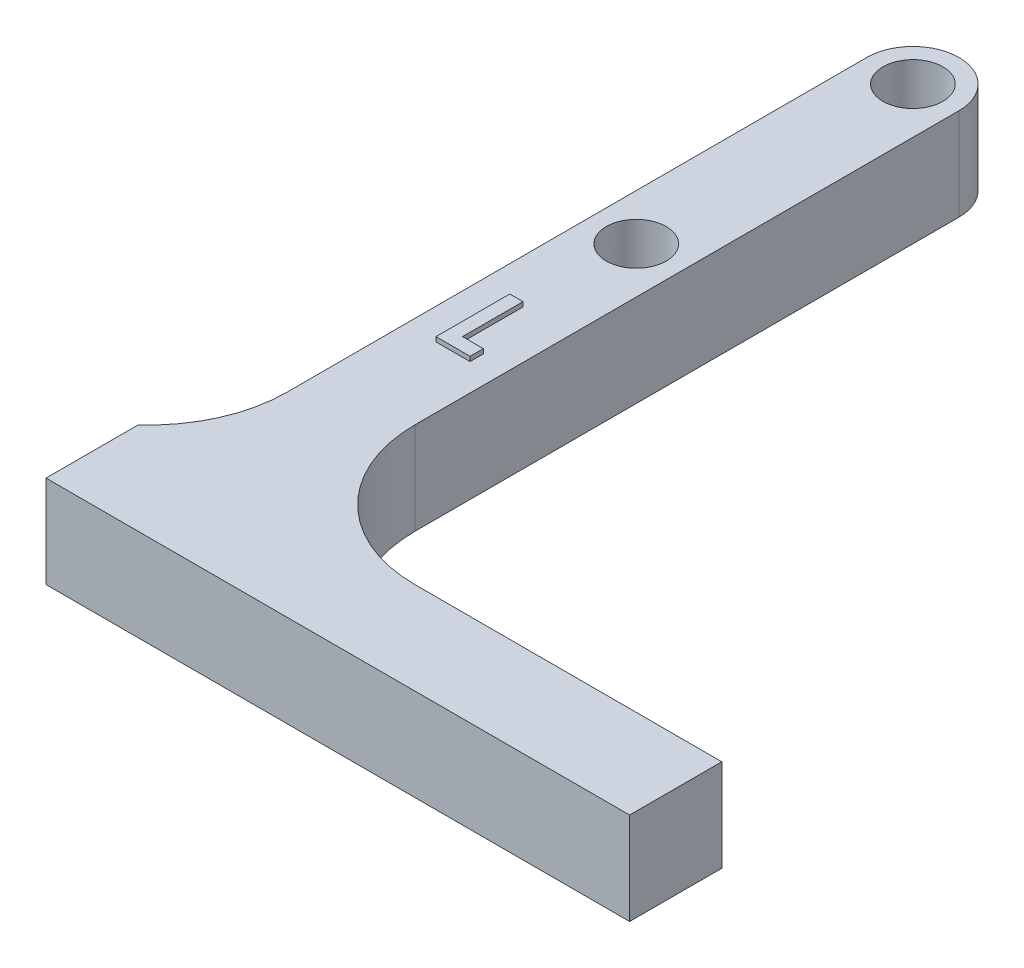
ISO-10303-21;
HEADER;
FILE_DESCRIPTION(('STEP AP214'),'2;1');
FILE_NAME('part.step','',(''),(''),'','','');
FILE_SCHEMA(('AUTOMOTIVE_DESIGN { 1 0 10303 214 1 1 1 1 }'));
ENDSEC;
DATA;
#1=APPLICATION_CONTEXT('core data for automotive mechanical design processes');
#2=APPLICATION_PROTOCOL_DEFINITION('international standard','automotive_design',2000,#1);
#3=PRODUCT_CONTEXT('',#1,'mechanical');
#4=PRODUCT('Part','Part','',(#3));
#5=PRODUCT_RELATED_PRODUCT_CATEGORY('part','',(#4));
#6=PRODUCT_DEFINITION_FORMATION('','',#4);
#7=PRODUCT_DEFINITION_CONTEXT('part definition',#1,'design');
#8=PRODUCT_DEFINITION('design','',#6,#7);
#9=PRODUCT_DEFINITION_SHAPE('','',#8);
#10=(LENGTH_UNIT() NAMED_UNIT(*) SI_UNIT(.MILLI.,.METRE.));
#11=(NAMED_UNIT(*) PLANE_ANGLE_UNIT() SI_UNIT($,.RADIAN.));
#12=(NAMED_UNIT(*) SI_UNIT($,.STERADIAN.) SOLID_ANGLE_UNIT());
#13=UNCERTAINTY_MEASURE_WITH_UNIT(LENGTH_MEASURE(1.E-05),#10,'distance_accuracy_value','');
#14=(GEOMETRIC_REPRESENTATION_CONTEXT(3) GLOBAL_UNCERTAINTY_ASSIGNED_CONTEXT((#13)) GLOBAL_UNIT_ASSIGNED_CONTEXT((#10,
#11,#12)) REPRESENTATION_CONTEXT('',''));
#15=CARTESIAN_POINT('',(0.,0.,0.));
#16=DIRECTION('',(0.,0.,1.));
#17=DIRECTION('',(1.,0.,0.));
#18=AXIS2_PLACEMENT_3D('',#15,#16,#17);
#19=CARTESIAN_POINT('',(10.,10.,0.));
#20=DIRECTION('',(0.,0.,-1.));
#21=DIRECTION('',(-1.,0.,0.));
#22=AXIS2_PLACEMENT_3D('',#19,#20,#21);
#23=PLANE('',#22);
#24=DIRECTION('',(1.,0.,0.));
#25=VECTOR('',#24,1.);
#26=CARTESIAN_POINT('',(10.,0.,0.));
#27=LINE('',#26,#25);
#28=CARTESIAN_POINT('',(-5.,0.,0.));
#29=VERTEX_POINT('',#28);
#30=CARTESIAN_POINT('',(58.28,0.,0.));
#31=VERTEX_POINT('',#30);
#32=EDGE_CURVE('E235',#29,#31,#27,.T.);
#33=ORIENTED_EDGE('',*,*,#32,.T.);
#34=DIRECTION('',(0.,-1.,0.));
#35=VECTOR('',#34,1.);
#36=CARTESIAN_POINT('',(58.28,10.,0.));
#37=LINE('',#36,#35);
#38=CARTESIAN_POINT('',(58.28,10.,0.));
#39=VERTEX_POINT('',#38);
#40=EDGE_CURVE('E303',#39,#31,#37,.T.);
#41=ORIENTED_EDGE('',*,*,#40,.F.);
#42=DIRECTION('',(1.,0.,0.));
#43=VECTOR('',#42,1.);
#44=CARTESIAN_POINT('',(0.,10.,0.));
#45=LINE('',#44,#43);
#46=CARTESIAN_POINT('',(-5.,10.,0.));
#47=VERTEX_POINT('',#46);
#48=EDGE_CURVE('E239',#47,#39,#45,.T.);
#49=ORIENTED_EDGE('',*,*,#48,.F.);
#50=DIRECTION('',(0.,-1.,0.));
#51=VECTOR('',#50,1.);
#52=CARTESIAN_POINT('',(-5.,10.,0.));
#53=LINE('',#52,#51);
#54=EDGE_CURVE('E262',#47,#29,#53,.T.);
#55=ORIENTED_EDGE('',*,*,#54,.T.);
#56=EDGE_LOOP('',(#33,#41,#49,#55));
#57=FACE_BOUND('',#56,.T.);
#58=ADVANCED_FACE('F40',(#57),#23,.F.);
#59=CARTESIAN_POINT('',(58.28,10.,0.));
#60=DIRECTION('',(-1.,0.,0.));
#61=DIRECTION('',(0.,0.,1.));
#62=AXIS2_PLACEMENT_3D('',#59,#60,#61);
#63=PLANE('',#62);
#64=DIRECTION('',(0.,0.,-1.));
#65=VECTOR('',#64,1.);
#66=CARTESIAN_POINT('',(58.28,0.,0.));
#67=LINE('',#66,#65);
#68=CARTESIAN_POINT('',(58.28,0.,-10.));
#69=VERTEX_POINT('',#68);
#70=EDGE_CURVE('E265',#31,#69,#67,.T.);
#71=ORIENTED_EDGE('',*,*,#70,.T.);
#72=DIRECTION('',(0.,-1.,0.));
#73=VECTOR('',#72,1.);
#74=CARTESIAN_POINT('',(58.28,10.,-10.));
#75=LINE('',#74,#73);
#76=CARTESIAN_POINT('',(58.28,10.,-10.));
#77=VERTEX_POINT('',#76);
#78=EDGE_CURVE('E299',#77,#69,#75,.T.);
#79=ORIENTED_EDGE('',*,*,#78,.F.);
#80=DIRECTION('',(0.,0.,-1.));
#81=VECTOR('',#80,1.);
#82=CARTESIAN_POINT('',(58.28,10.,0.));
#83=LINE('',#82,#81);
#84=EDGE_CURVE('E242',#39,#77,#83,.T.);
#85=ORIENTED_EDGE('',*,*,#84,.F.);
#86=ORIENTED_EDGE('',*,*,#40,.T.);
#87=EDGE_LOOP('',(#71,#79,#85,#86));
#88=FACE_BOUND('',#87,.T.);
#89=ADVANCED_FACE('F365',(#88),#63,.F.);
#90=CARTESIAN_POINT('',(10.,10.,-10.));
#91=DIRECTION('',(0.,0.,1.));
#92=DIRECTION('',(1.,0.,0.));
#93=AXIS2_PLACEMENT_3D('',#90,#91,#92);
#94=PLANE('',#93);
#95=DIRECTION('',(-1.,0.,0.));
#96=VECTOR('',#95,1.);
#97=CARTESIAN_POINT('',(10.,0.,-10.));
#98=LINE('',#97,#96);
#99=CARTESIAN_POINT('',(25.,0.,-10.));
#100=VERTEX_POINT('',#99);
#101=EDGE_CURVE('E268',#69,#100,#98,.T.);
#102=ORIENTED_EDGE('',*,*,#101,.T.);
#103=DIRECTION('',(0.,-1.,0.));
#104=VECTOR('',#103,1.);
#105=CARTESIAN_POINT('',(25.,10.,-10.));
#106=LINE('',#105,#104);
#107=CARTESIAN_POINT('',(25.,10.,-10.));
#108=VERTEX_POINT('',#107);
#109=EDGE_CURVE('E56',#100,#108,#106,.F.);
#110=ORIENTED_EDGE('',*,*,#109,.T.);
#111=DIRECTION('',(-1.,0.,0.));
#112=VECTOR('',#111,1.);
#113=CARTESIAN_POINT('',(10.,10.,-10.));
#114=LINE('',#113,#112);
#115=EDGE_CURVE('E246',#77,#108,#114,.T.);
#116=ORIENTED_EDGE('',*,*,#115,.F.);
#117=ORIENTED_EDGE('',*,*,#78,.T.);
#118=EDGE_LOOP('',(#102,#110,#116,#117));
#119=FACE_BOUND('',#118,.T.);
#120=ADVANCED_FACE('F362',(#119),#94,.F.);
#121=CARTESIAN_POINT('',(10.,10.,-10.));
#122=DIRECTION('',(-1.,0.,0.));
#123=DIRECTION('',(0.,0.,1.));
#124=AXIS2_PLACEMENT_3D('',#121,#122,#123);
#125=PLANE('',#124);
#126=DIRECTION('',(0.,0.,-1.));
#127=VECTOR('',#126,1.);
#128=CARTESIAN_POINT('',(10.,10.,-10.));
#129=LINE('',#128,#127);
#130=CARTESIAN_POINT('',(10.,10.,-25.));
#131=VERTEX_POINT('',#130);
#132=CARTESIAN_POINT('',(10.,10.,-84.));
#133=VERTEX_POINT('',#132);
#134=EDGE_CURVE('E249',#131,#133,#129,.T.);
#135=ORIENTED_EDGE('',*,*,#134,.F.);
#136=DIRECTION('',(0.,-1.,0.));
#137=VECTOR('',#136,1.);
#138=CARTESIAN_POINT('',(10.,0.,-25.));
#139=LINE('',#138,#137);
#140=CARTESIAN_POINT('',(10.,0.,-25.));
#141=VERTEX_POINT('',#140);
#142=EDGE_CURVE('E318',#131,#141,#139,.T.);
#143=ORIENTED_EDGE('',*,*,#142,.T.);
#144=DIRECTION('',(0.,0.,-1.));
#145=VECTOR('',#144,1.);
#146=CARTESIAN_POINT('',(10.,0.,-10.));
#147=LINE('',#146,#145);
#148=CARTESIAN_POINT('',(10.,0.,-84.));
#149=VERTEX_POINT('',#148);
#150=EDGE_CURVE('E271',#141,#149,#147,.T.);
#151=ORIENTED_EDGE('',*,*,#150,.T.);
#152=DIRECTION('',(0.,-1.,0.));
#153=VECTOR('',#152,1.);
#154=CARTESIAN_POINT('',(10.,10.,-84.));
#155=LINE('',#154,#153);
#156=EDGE_CURVE('E295',#133,#149,#155,.T.);
#157=ORIENTED_EDGE('',*,*,#156,.F.);
#158=EDGE_LOOP('',(#135,#143,#151,#157));
#159=FACE_BOUND('',#158,.T.);
#160=ADVANCED_FACE('F356',(#159),#125,.F.);
#161=CARTESIAN_POINT('',(5.,10.,-84.));
#162=DIRECTION('',(0.,-1.,0.));
#163=DIRECTION('',(0.,0.,-1.));
#164=AXIS2_PLACEMENT_3D('',#161,#162,#163);
#165=CYLINDRICAL_SURFACE('',#164,5.);
#166=CARTESIAN_POINT('',(5.,0.,-84.));
#167=DIRECTION('',(0.,1.,0.));
#168=DIRECTION('',(0.,0.,-1.));
#169=AXIS2_PLACEMENT_3D('',#166,#167,#168);
#170=CIRCLE('',#169,5.);
#171=CARTESIAN_POINT('',(0.,0.,-84.));
#172=VERTEX_POINT('',#171);
#173=EDGE_CURVE('E274',#149,#172,#170,.T.);
#174=ORIENTED_EDGE('',*,*,#173,.T.);
#175=DIRECTION('',(0.,-1.,0.));
#176=VECTOR('',#175,1.);
#177=CARTESIAN_POINT('',(0.,10.,-84.));
#178=LINE('',#177,#176);
#179=CARTESIAN_POINT('',(0.,10.,-84.));
#180=VERTEX_POINT('',#179);
#181=EDGE_CURVE('E291',#180,#172,#178,.T.);
#182=ORIENTED_EDGE('',*,*,#181,.F.);
#183=CARTESIAN_POINT('',(5.,10.,-84.));
#184=DIRECTION('',(0.,1.,0.));
#185=DIRECTION('',(0.,0.,-1.));
#186=AXIS2_PLACEMENT_3D('',#183,#184,#185);
#187=CIRCLE('',#186,5.);
#188=EDGE_CURVE('E252',#133,#180,#187,.T.);
#189=ORIENTED_EDGE('',*,*,#188,.F.);
#190=ORIENTED_EDGE('',*,*,#156,.T.);
#191=EDGE_LOOP('',(#174,#182,#189,#190));
#192=FACE_BOUND('',#191,.T.);
#193=ADVANCED_FACE('F352',(#192),#165,.T.);
#194=CARTESIAN_POINT('',(0.,10.,-10.));
#195=DIRECTION('',(1.,0.,0.));
#196=DIRECTION('',(0.,0.,-1.));
#197=AXIS2_PLACEMENT_3D('',#194,#195,#196);
#198=PLANE('',#197);
#199=DIRECTION('',(0.,0.,1.));
#200=VECTOR('',#199,1.);
#201=CARTESIAN_POINT('',(0.,0.,-10.));
#202=LINE('',#201,#200);
#203=CARTESIAN_POINT('',(0.,0.,-21.1803398874989));
#204=VERTEX_POINT('',#203);
#205=EDGE_CURVE('E277',#172,#204,#202,.T.);
#206=ORIENTED_EDGE('',*,*,#205,.T.);
#207=DIRECTION('',(0.,1.,0.));
#208=VECTOR('',#207,1.);
#209=CARTESIAN_POINT('',(0.,10.,-21.1803398874989));
#210=LINE('',#209,#208);
#211=CARTESIAN_POINT('',(0.,10.,-21.1803398874989));
#212=VERTEX_POINT('',#211);
#213=EDGE_CURVE('E307',#204,#212,#210,.T.);
#214=ORIENTED_EDGE('',*,*,#213,.T.);
#215=DIRECTION('',(0.,0.,1.));
#216=VECTOR('',#215,1.);
#217=CARTESIAN_POINT('',(0.,10.,-10.));
#218=LINE('',#217,#216);
#219=EDGE_CURVE('E255',#180,#212,#218,.T.);
#220=ORIENTED_EDGE('',*,*,#219,.F.);
#221=ORIENTED_EDGE('',*,*,#181,.T.);
#222=EDGE_LOOP('',(#206,#214,#220,#221));
#223=FACE_BOUND('',#222,.T.);
#224=ADVANCED_FACE('F348',(#223),#198,.F.);
#225=CARTESIAN_POINT('',(-5.,10.,-10.));
#226=DIRECTION('',(1.,0.,0.));
#227=DIRECTION('',(0.,0.,-1.));
#228=AXIS2_PLACEMENT_3D('',#225,#226,#227);
#229=PLANE('',#228);
#230=DIRECTION('',(0.,0.,1.));
#231=VECTOR('',#230,1.);
#232=CARTESIAN_POINT('',(-5.,0.,-10.));
#233=LINE('',#232,#231);
#234=CARTESIAN_POINT('',(-5.,0.,-10.));
#235=VERTEX_POINT('',#234);
#236=EDGE_CURVE('E243',#235,#29,#233,.T.);
#237=ORIENTED_EDGE('',*,*,#236,.T.);
#238=ORIENTED_EDGE('',*,*,#54,.F.);
#239=DIRECTION('',(0.,0.,1.));
#240=VECTOR('',#239,1.);
#241=CARTESIAN_POINT('',(-5.,10.,-10.));
#242=LINE('',#241,#240);
#243=CARTESIAN_POINT('',(-5.,10.,-10.));
#244=VERTEX_POINT('',#243);
#245=EDGE_CURVE('E259',#244,#47,#242,.T.);
#246=ORIENTED_EDGE('',*,*,#245,.F.);
#247=DIRECTION('',(0.,-1.,0.));
#248=VECTOR('',#247,1.);
#249=CARTESIAN_POINT('',(-5.,10.,-10.));
#250=LINE('',#249,#248);
#251=EDGE_CURVE('E287',#244,#235,#250,.T.);
#252=ORIENTED_EDGE('',*,*,#251,.T.);
#253=EDGE_LOOP('',(#237,#238,#246,#252));
#254=FACE_BOUND('',#253,.T.);
#255=ADVANCED_FACE('F340',(#254),#229,.F.);
#256=CARTESIAN_POINT('',(5.,10.,-84.));
#257=DIRECTION('',(0.,-1.,0.));
#258=DIRECTION('',(0.,0.,-1.));
#259=AXIS2_PLACEMENT_3D('',#256,#257,#258);
#260=PLANE('',#259);
#261=CARTESIAN_POINT('',(5.,10.,-84.));
#262=DIRECTION('',(0.,1.,0.));
#263=DIRECTION('',(0.,0.,1.));
#264=AXIS2_PLACEMENT_3D('',#261,#262,#263);
#265=CIRCLE('',#264,3.25);
#266=CARTESIAN_POINT('',(5.,10.,-80.75));
#267=VERTEX_POINT('',#266);
#268=EDGE_CURVE('E599',#267,#267,#265,.T.);
#269=ORIENTED_EDGE('',*,*,#268,.F.);
#270=EDGE_LOOP('',(#269));
#271=FACE_BOUND('',#270,.T.);
#272=CARTESIAN_POINT('',(5.,10.,-54.));
#273=DIRECTION('',(0.,1.,0.));
#274=DIRECTION('',(0.,0.,1.));
#275=AXIS2_PLACEMENT_3D('',#272,#273,#274);
#276=CIRCLE('',#275,3.25);
#277=CARTESIAN_POINT('',(5.,10.,-50.75));
#278=VERTEX_POINT('',#277);
#279=EDGE_CURVE('E604',#278,#278,#276,.T.);
#280=ORIENTED_EDGE('',*,*,#279,.F.);
#281=EDGE_LOOP('',(#280));
#282=FACE_BOUND('',#281,.T.);
#283=DIRECTION('',(-1.,0.,0.));
#284=VECTOR('',#283,1.);
#285=CARTESIAN_POINT('',(7.05128205128205,10.,-33.9300041510496));
#286=LINE('',#285,#284);
#287=CARTESIAN_POINT('',(7.05128205128205,10.,-33.9300041510496));
#288=VERTEX_POINT('',#287);
#289=CARTESIAN_POINT('',(3.35897435897436,10.,-33.9300041510496));
#290=VERTEX_POINT('',#289);
#291=EDGE_CURVE('E178',#288,#290,#286,.T.);
#292=ORIENTED_EDGE('',*,*,#291,.T.);
#293=DIRECTION('',(0.,0.,-1.));
#294=VECTOR('',#293,1.);
#295=CARTESIAN_POINT('',(3.35897435897436,10.,-33.9300041510496));
#296=LINE('',#295,#294);
#297=CARTESIAN_POINT('',(3.35897435897436,10.,-41.9300041510496));
#298=VERTEX_POINT('',#297);
#299=EDGE_CURVE('E200',#290,#298,#296,.T.);
#300=ORIENTED_EDGE('',*,*,#299,.T.);
#301=DIRECTION('',(1.,0.,0.));
#302=VECTOR('',#301,1.);
#303=CARTESIAN_POINT('',(3.35897435897436,10.,-41.9300041510496));
#304=LINE('',#303,#302);
#305=CARTESIAN_POINT('',(4.79487179487179,10.,-41.9300041510496));
#306=VERTEX_POINT('',#305);
#307=EDGE_CURVE('E154',#298,#306,#304,.T.);
#308=ORIENTED_EDGE('',*,*,#307,.T.);
#309=DIRECTION('',(0.,0.,1.));
#310=VECTOR('',#309,1.);
#311=CARTESIAN_POINT('',(4.79487179487179,10.,-41.9300041510496));
#312=LINE('',#311,#310);
#313=CARTESIAN_POINT('',(4.79487179487179,10.,-35.3659015869471));
#314=VERTEX_POINT('',#313);
#315=EDGE_CURVE('E206',#306,#314,#312,.T.);
#316=ORIENTED_EDGE('',*,*,#315,.T.);
#317=DIRECTION('',(1.,0.,0.));
#318=VECTOR('',#317,1.);
#319=CARTESIAN_POINT('',(4.79487179487179,10.,-35.3659015869471));
#320=LINE('',#319,#318);
#321=CARTESIAN_POINT('',(7.05128205128205,10.,-35.3659015869471));
#322=VERTEX_POINT('',#321);
#323=EDGE_CURVE('E210',#314,#322,#320,.T.);
#324=ORIENTED_EDGE('',*,*,#323,.T.);
#325=DIRECTION('',(0.,0.,1.));
#326=VECTOR('',#325,1.);
#327=CARTESIAN_POINT('',(7.05128205128205,10.,-35.3659015869471));
#328=LINE('',#327,#326);
#329=EDGE_CURVE('E182',#322,#288,#328,.T.);
#330=ORIENTED_EDGE('',*,*,#329,.T.);
#331=EDGE_LOOP('',(#292,#300,#308,#316,#324,#330));
#332=FACE_BOUND('',#331,.T.);
#333=ORIENTED_EDGE('',*,*,#48,.T.);
#334=ORIENTED_EDGE('',*,*,#84,.T.);
#335=ORIENTED_EDGE('',*,*,#115,.T.);
#336=CARTESIAN_POINT('',(25.,10.,-25.));
#337=DIRECTION('',(0.,-1.,0.));
#338=DIRECTION('',(0.,0.,-1.));
#339=AXIS2_PLACEMENT_3D('',#336,#337,#338);
#340=CIRCLE('',#339,15.);
#341=EDGE_CURVE('E12',#108,#131,#340,.T.);
#342=ORIENTED_EDGE('',*,*,#341,.T.);
#343=ORIENTED_EDGE('',*,*,#134,.T.);
#344=ORIENTED_EDGE('',*,*,#188,.T.);
#345=ORIENTED_EDGE('',*,*,#219,.T.);
#346=CARTESIAN_POINT('',(-15.,10.,-21.1803398874989));
#347=DIRECTION('',(0.,-1.,0.));
#348=DIRECTION('',(0.,0.,-1.));
#349=AXIS2_PLACEMENT_3D('',#346,#347,#348);
#350=CIRCLE('',#349,15.);
#351=EDGE_CURVE('E327',#212,#244,#350,.T.);
#352=ORIENTED_EDGE('',*,*,#351,.T.);
#353=ORIENTED_EDGE('',*,*,#245,.T.);
#354=EDGE_LOOP('',(#333,#334,#335,#342,#343,#344,#345,#352,#353));
#355=FACE_BOUND('',#354,.T.);
#356=ADVANCED_FACE('F333',(#271,#282,#332,#355),#260,.F.);
#357=CARTESIAN_POINT('',(5.,0.,-84.));
#358=DIRECTION('',(0.,-1.,0.));
#359=DIRECTION('',(0.,0.,-1.));
#360=AXIS2_PLACEMENT_3D('',#357,#358,#359);
#361=PLANE('',#360);
#362=CARTESIAN_POINT('',(5.,0.,-84.));
#363=DIRECTION('',(0.,1.,0.));
#364=DIRECTION('',(0.,0.,1.));
#365=AXIS2_PLACEMENT_3D('',#362,#363,#364);
#366=CIRCLE('',#365,1.5);
#367=CARTESIAN_POINT('',(5.,0.,-82.5));
#368=VERTEX_POINT('',#367);
#369=EDGE_CURVE('E231',#368,#368,#366,.T.);
#370=ORIENTED_EDGE('',*,*,#369,.T.);
#371=EDGE_LOOP('',(#370));
#372=FACE_BOUND('',#371,.T.);
#373=CARTESIAN_POINT('',(5.,0.,-54.));
#374=DIRECTION('',(0.,1.,0.));
#375=DIRECTION('',(0.,0.,1.));
#376=AXIS2_PLACEMENT_3D('',#373,#374,#375);
#377=CIRCLE('',#376,1.5);
#378=CARTESIAN_POINT('',(5.,0.,-52.5));
#379=VERTEX_POINT('',#378);
#380=EDGE_CURVE('E219',#379,#379,#377,.T.);
#381=ORIENTED_EDGE('',*,*,#380,.T.);
#382=EDGE_LOOP('',(#381));
#383=FACE_BOUND('',#382,.T.);
#384=ORIENTED_EDGE('',*,*,#32,.F.);
#385=ORIENTED_EDGE('',*,*,#236,.F.);
#386=CARTESIAN_POINT('',(-15.,0.,-21.1803398874989));
#387=DIRECTION('',(0.,-1.,0.));
#388=DIRECTION('',(0.,0.,-1.));
#389=AXIS2_PLACEMENT_3D('',#386,#387,#388);
#390=CIRCLE('',#389,15.);
#391=EDGE_CURVE('E324',#235,#204,#390,.F.);
#392=ORIENTED_EDGE('',*,*,#391,.T.);
#393=ORIENTED_EDGE('',*,*,#205,.F.);
#394=ORIENTED_EDGE('',*,*,#173,.F.);
#395=ORIENTED_EDGE('',*,*,#150,.F.);
#396=CARTESIAN_POINT('',(25.,0.,-25.));
#397=DIRECTION('',(0.,-1.,0.));
#398=DIRECTION('',(0.,0.,-1.));
#399=AXIS2_PLACEMENT_3D('',#396,#397,#398);
#400=CIRCLE('',#399,15.);
#401=EDGE_CURVE('E49',#141,#100,#400,.F.);
#402=ORIENTED_EDGE('',*,*,#401,.T.);
#403=ORIENTED_EDGE('',*,*,#101,.F.);
#404=ORIENTED_EDGE('',*,*,#70,.F.);
#405=EDGE_LOOP('',(#384,#385,#392,#393,#394,#395,#402,#403,#404));
#406=FACE_BOUND('',#405,.T.);
#407=ADVANCED_FACE('F345',(#372,#383,#406),#361,.T.);
#408=CARTESIAN_POINT('',(5.,0.,-54.));
#409=DIRECTION('',(0.,1.,0.));
#410=DIRECTION('',(0.,0.,1.));
#411=AXIS2_PLACEMENT_3D('',#408,#409,#410);
#412=CYLINDRICAL_SURFACE('',#411,1.5);
#413=CARTESIAN_POINT('',(5.,5.,-54.));
#414=DIRECTION('',(0.,-1.,0.));
#415=DIRECTION('',(0.,0.,-1.));
#416=AXIS2_PLACEMENT_3D('',#413,#414,#415);
#417=CIRCLE('',#416,1.5);
#418=CARTESIAN_POINT('',(5.,5.,-55.5));
#419=VERTEX_POINT('',#418);
#420=EDGE_CURVE('E203',#419,#419,#417,.F.);
#421=ORIENTED_EDGE('',*,*,#420,.T.);
#422=EDGE_LOOP('',(#421));
#423=FACE_BOUND('',#422,.T.);
#424=ORIENTED_EDGE('',*,*,#380,.F.);
#425=EDGE_LOOP('',(#424));
#426=FACE_BOUND('',#425,.T.);
#427=ADVANCED_FACE('F421',(#423,#426),#412,.F.);
#428=CARTESIAN_POINT('',(5.,0.,-84.));
#429=DIRECTION('',(0.,1.,0.));
#430=DIRECTION('',(0.,0.,1.));
#431=AXIS2_PLACEMENT_3D('',#428,#429,#430);
#432=CYLINDRICAL_SURFACE('',#431,1.5);
#433=CARTESIAN_POINT('',(5.,5.,-84.));
#434=DIRECTION('',(0.,-1.,0.));
#435=DIRECTION('',(0.,0.,-1.));
#436=AXIS2_PLACEMENT_3D('',#433,#434,#435);
#437=CIRCLE('',#436,1.5);
#438=CARTESIAN_POINT('',(5.,5.,-85.5));
#439=VERTEX_POINT('',#438);
#440=EDGE_CURVE('E308',#439,#439,#437,.F.);
#441=ORIENTED_EDGE('',*,*,#440,.T.);
#442=EDGE_LOOP('',(#441));
#443=FACE_BOUND('',#442,.T.);
#444=ORIENTED_EDGE('',*,*,#369,.F.);
#445=EDGE_LOOP('',(#444));
#446=FACE_BOUND('',#445,.T.);
#447=ADVANCED_FACE('F418',(#443,#446),#432,.F.);
#448=CARTESIAN_POINT('',(3.35897435897436,10.5,-33.9300041510496));
#449=DIRECTION('',(-1.,0.,0.));
#450=DIRECTION('',(0.,0.,1.));
#451=AXIS2_PLACEMENT_3D('',#448,#449,#450);
#452=PLANE('',#451);
#453=ORIENTED_EDGE('',*,*,#299,.F.);
#454=DIRECTION('',(0.,-1.,0.));
#455=VECTOR('',#454,1.);
#456=CARTESIAN_POINT('',(3.35897435897436,10.5,-33.9300041510496));
#457=LINE('',#456,#455);
#458=CARTESIAN_POINT('',(3.35897435897436,10.5,-33.9300041510496));
#459=VERTEX_POINT('',#458);
#460=EDGE_CURVE('E176',#459,#290,#457,.T.);
#461=ORIENTED_EDGE('',*,*,#460,.F.);
#462=DIRECTION('',(0.,0.,-1.));
#463=VECTOR('',#462,1.);
#464=CARTESIAN_POINT('',(3.35897435897436,10.5,-33.9300041510496));
#465=LINE('',#464,#463);
#466=CARTESIAN_POINT('',(3.35897435897436,10.5,-41.9300041510496));
#467=VERTEX_POINT('',#466);
#468=EDGE_CURVE('E168',#459,#467,#465,.T.);
#469=ORIENTED_EDGE('',*,*,#468,.T.);
#470=DIRECTION('',(0.,-1.,0.));
#471=VECTOR('',#470,1.);
#472=CARTESIAN_POINT('',(3.35897435897436,10.5,-41.9300041510496));
#473=LINE('',#472,#471);
#474=EDGE_CURVE('E148',#467,#298,#473,.T.);
#475=ORIENTED_EDGE('',*,*,#474,.T.);
#476=EDGE_LOOP('',(#453,#461,#469,#475));
#477=FACE_BOUND('',#476,.T.);
#478=ADVANCED_FACE('F175',(#477),#452,.T.);
#479=CARTESIAN_POINT('',(7.05128205128205,10.5,-33.9300041510496));
#480=DIRECTION('',(0.,0.,1.));
#481=DIRECTION('',(1.,0.,0.));
#482=AXIS2_PLACEMENT_3D('',#479,#480,#481);
#483=PLANE('',#482);
#484=ORIENTED_EDGE('',*,*,#291,.F.);
#485=DIRECTION('',(0.,-1.,0.));
#486=VECTOR('',#485,1.);
#487=CARTESIAN_POINT('',(7.05128205128205,10.5,-33.9300041510496));
#488=LINE('',#487,#486);
#489=CARTESIAN_POINT('',(7.05128205128205,10.5,-33.9300041510496));
#490=VERTEX_POINT('',#489);
#491=EDGE_CURVE('E220',#490,#288,#488,.T.);
#492=ORIENTED_EDGE('',*,*,#491,.F.);
#493=DIRECTION('',(-1.,0.,0.));
#494=VECTOR('',#493,1.);
#495=CARTESIAN_POINT('',(7.05128205128205,10.5,-33.9300041510496));
#496=LINE('',#495,#494);
#497=EDGE_CURVE('E161',#490,#459,#496,.T.);
#498=ORIENTED_EDGE('',*,*,#497,.T.);
#499=ORIENTED_EDGE('',*,*,#460,.T.);
#500=EDGE_LOOP('',(#484,#492,#498,#499));
#501=FACE_BOUND('',#500,.T.);
#502=ADVANCED_FACE('F398',(#501),#483,.T.);
#503=CARTESIAN_POINT('',(7.05128205128205,10.5,-35.3659015869471));
#504=DIRECTION('',(1.,0.,0.));
#505=DIRECTION('',(0.,0.,-1.));
#506=AXIS2_PLACEMENT_3D('',#503,#504,#505);
#507=PLANE('',#506);
#508=ORIENTED_EDGE('',*,*,#329,.F.);
#509=DIRECTION('',(0.,-1.,0.));
#510=VECTOR('',#509,1.);
#511=CARTESIAN_POINT('',(7.05128205128205,10.5,-35.3659015869471));
#512=LINE('',#511,#510);
#513=CARTESIAN_POINT('',(7.05128205128205,10.5,-35.3659015869471));
#514=VERTEX_POINT('',#513);
#515=EDGE_CURVE('E223',#514,#322,#512,.T.);
#516=ORIENTED_EDGE('',*,*,#515,.F.);
#517=DIRECTION('',(0.,0.,1.));
#518=VECTOR('',#517,1.);
#519=CARTESIAN_POINT('',(7.05128205128205,10.5,-35.3659015869471));
#520=LINE('',#519,#518);
#521=EDGE_CURVE('E194',#514,#490,#520,.T.);
#522=ORIENTED_EDGE('',*,*,#521,.T.);
#523=ORIENTED_EDGE('',*,*,#491,.T.);
#524=EDGE_LOOP('',(#508,#516,#522,#523));
#525=FACE_BOUND('',#524,.T.);
#526=ADVANCED_FACE('F401',(#525),#507,.T.);
#527=CARTESIAN_POINT('',(4.79487179487179,10.5,-35.3659015869471));
#528=DIRECTION('',(0.,0.,-1.));
#529=DIRECTION('',(-1.,0.,0.));
#530=AXIS2_PLACEMENT_3D('',#527,#528,#529);
#531=PLANE('',#530);
#532=ORIENTED_EDGE('',*,*,#323,.F.);
#533=DIRECTION('',(0.,-1.,0.));
#534=VECTOR('',#533,1.);
#535=CARTESIAN_POINT('',(4.79487179487179,10.5,-35.3659015869471));
#536=LINE('',#535,#534);
#537=CARTESIAN_POINT('',(4.79487179487179,10.5,-35.3659015869471));
#538=VERTEX_POINT('',#537);
#539=EDGE_CURVE('E226',#538,#314,#536,.T.);
#540=ORIENTED_EDGE('',*,*,#539,.F.);
#541=DIRECTION('',(1.,0.,0.));
#542=VECTOR('',#541,1.);
#543=CARTESIAN_POINT('',(4.79487179487179,10.5,-35.3659015869471));
#544=LINE('',#543,#542);
#545=EDGE_CURVE('E190',#538,#514,#544,.T.);
#546=ORIENTED_EDGE('',*,*,#545,.T.);
#547=ORIENTED_EDGE('',*,*,#515,.T.);
#548=EDGE_LOOP('',(#532,#540,#546,#547));
#549=FACE_BOUND('',#548,.T.);
#550=ADVANCED_FACE('F405',(#549),#531,.T.);
#551=CARTESIAN_POINT('',(4.79487179487179,10.5,-41.9300041510496));
#552=DIRECTION('',(1.,0.,0.));
#553=DIRECTION('',(0.,0.,-1.));
#554=AXIS2_PLACEMENT_3D('',#551,#552,#553);
#555=PLANE('',#554);
#556=ORIENTED_EDGE('',*,*,#315,.F.);
#557=DIRECTION('',(0.,-1.,0.));
#558=VECTOR('',#557,1.);
#559=CARTESIAN_POINT('',(4.79487179487179,10.5,-41.9300041510496));
#560=LINE('',#559,#558);
#561=CARTESIAN_POINT('',(4.79487179487179,10.5,-41.9300041510496));
#562=VERTEX_POINT('',#561);
#563=EDGE_CURVE('E160',#562,#306,#560,.T.);
#564=ORIENTED_EDGE('',*,*,#563,.F.);
#565=DIRECTION('',(0.,0.,1.));
#566=VECTOR('',#565,1.);
#567=CARTESIAN_POINT('',(4.79487179487179,10.5,-41.9300041510496));
#568=LINE('',#567,#566);
#569=EDGE_CURVE('E172',#562,#538,#568,.T.);
#570=ORIENTED_EDGE('',*,*,#569,.T.);
#571=ORIENTED_EDGE('',*,*,#539,.T.);
#572=EDGE_LOOP('',(#556,#564,#570,#571));
#573=FACE_BOUND('',#572,.T.);
#574=ADVANCED_FACE('F409',(#573),#555,.T.);
#575=CARTESIAN_POINT('',(3.35897435897436,10.5,-41.9300041510496));
#576=DIRECTION('',(0.,0.,-1.));
#577=DIRECTION('',(-1.,0.,0.));
#578=AXIS2_PLACEMENT_3D('',#575,#576,#577);
#579=PLANE('',#578);
#580=ORIENTED_EDGE('',*,*,#307,.F.);
#581=ORIENTED_EDGE('',*,*,#474,.F.);
#582=DIRECTION('',(1.,0.,0.));
#583=VECTOR('',#582,1.);
#584=CARTESIAN_POINT('',(3.35897435897436,10.5,-41.9300041510496));
#585=LINE('',#584,#583);
#586=EDGE_CURVE('E152',#467,#562,#585,.T.);
#587=ORIENTED_EDGE('',*,*,#586,.T.);
#588=ORIENTED_EDGE('',*,*,#563,.T.);
#589=EDGE_LOOP('',(#580,#581,#587,#588));
#590=FACE_BOUND('',#589,.T.);
#591=ADVANCED_FACE('F150',(#590),#579,.T.);
#592=CARTESIAN_POINT('',(0.,10.5,0.));
#593=DIRECTION('',(0.,-1.,0.));
#594=DIRECTION('',(0.,0.,-1.));
#595=AXIS2_PLACEMENT_3D('',#592,#593,#594);
#596=PLANE('',#595);
#597=ORIENTED_EDGE('',*,*,#468,.F.);
#598=ORIENTED_EDGE('',*,*,#497,.F.);
#599=ORIENTED_EDGE('',*,*,#521,.F.);
#600=ORIENTED_EDGE('',*,*,#545,.F.);
#601=ORIENTED_EDGE('',*,*,#569,.F.);
#602=ORIENTED_EDGE('',*,*,#586,.F.);
#603=EDGE_LOOP('',(#597,#598,#599,#600,#601,#602));
#604=FACE_BOUND('',#603,.T.);
#605=ADVANCED_FACE('F166',(#604),#596,.F.);
#606=CARTESIAN_POINT('',(5.,5.,-84.));
#607=DIRECTION('',(0.,-1.,0.));
#608=DIRECTION('',(0.,0.,-1.));
#609=AXIS2_PLACEMENT_3D('',#606,#607,#608);
#610=PLANE('',#609);
#611=CARTESIAN_POINT('',(5.,5.,-84.));
#612=DIRECTION('',(0.,-1.,0.));
#613=DIRECTION('',(0.,0.,-1.));
#614=AXIS2_PLACEMENT_3D('',#611,#612,#613);
#615=CIRCLE('',#614,3.25);
#616=CARTESIAN_POINT('',(5.,5.,-87.25));
#617=VERTEX_POINT('',#616);
#618=EDGE_CURVE('E312',#617,#617,#615,.F.);
#619=ORIENTED_EDGE('',*,*,#618,.T.);
#620=EDGE_LOOP('',(#619));
#621=FACE_BOUND('',#620,.T.);
#622=ORIENTED_EDGE('',*,*,#440,.F.);
#623=EDGE_LOOP('',(#622));
#624=FACE_BOUND('',#623,.T.);
#625=ADVANCED_FACE('F393',(#621,#624),#610,.F.);
#626=CARTESIAN_POINT('',(5.,-9.19238815542512,-84.));
#627=DIRECTION('',(0.,1.,0.));
#628=DIRECTION('',(0.,0.,1.));
#629=AXIS2_PLACEMENT_3D('',#626,#627,#628);
#630=CYLINDRICAL_SURFACE('',#629,3.25);
#631=ORIENTED_EDGE('',*,*,#268,.T.);
#632=EDGE_LOOP('',(#631));
#633=FACE_BOUND('',#632,.T.);
#634=ORIENTED_EDGE('',*,*,#618,.F.);
#635=EDGE_LOOP('',(#634));
#636=FACE_BOUND('',#635,.T.);
#637=ADVANCED_FACE('F387',(#633,#636),#630,.F.);
#638=CARTESIAN_POINT('',(5.,5.,-84.));
#639=DIRECTION('',(0.,-1.,0.));
#640=DIRECTION('',(0.,0.,-1.));
#641=AXIS2_PLACEMENT_3D('',#638,#639,#640);
#642=PLANE('',#641);
#643=CARTESIAN_POINT('',(5.,5.,-54.));
#644=DIRECTION('',(0.,-1.,0.));
#645=DIRECTION('',(0.,0.,-1.));
#646=AXIS2_PLACEMENT_3D('',#643,#644,#645);
#647=CIRCLE('',#646,3.25);
#648=CARTESIAN_POINT('',(5.,5.,-57.25));
#649=VERTEX_POINT('',#648);
#650=EDGE_CURVE('E185',#649,#649,#647,.F.);
#651=ORIENTED_EDGE('',*,*,#650,.T.);
#652=EDGE_LOOP('',(#651));
#653=FACE_BOUND('',#652,.T.);
#654=ORIENTED_EDGE('',*,*,#420,.F.);
#655=EDGE_LOOP('',(#654));
#656=FACE_BOUND('',#655,.T.);
#657=ADVANCED_FACE('F381',(#653,#656),#642,.F.);
#658=CARTESIAN_POINT('',(5.,-9.19238815542512,-54.));
#659=DIRECTION('',(0.,1.,0.));
#660=DIRECTION('',(0.,0.,1.));
#661=AXIS2_PLACEMENT_3D('',#658,#659,#660);
#662=CYLINDRICAL_SURFACE('',#661,3.25);
#663=ORIENTED_EDGE('',*,*,#279,.T.);
#664=EDGE_LOOP('',(#663));
#665=FACE_BOUND('',#664,.T.);
#666=ORIENTED_EDGE('',*,*,#650,.F.);
#667=EDGE_LOOP('',(#666));
#668=FACE_BOUND('',#667,.T.);
#669=ADVANCED_FACE('F376',(#665,#668),#662,.F.);
#670=CARTESIAN_POINT('',(-15.,10.,-21.1803398874989));
#671=DIRECTION('',(0.,1.,0.));
#672=DIRECTION('',(0.,0.,1.));
#673=AXIS2_PLACEMENT_3D('',#670,#671,#672);
#674=CYLINDRICAL_SURFACE('',#673,15.);
#675=ORIENTED_EDGE('',*,*,#351,.F.);
#676=ORIENTED_EDGE('',*,*,#213,.F.);
#677=ORIENTED_EDGE('',*,*,#391,.F.);
#678=ORIENTED_EDGE('',*,*,#251,.F.);
#679=EDGE_LOOP('',(#675,#676,#677,#678));
#680=FACE_BOUND('',#679,.T.);
#681=ADVANCED_FACE('F343',(#680),#674,.F.);
#682=CARTESIAN_POINT('',(25.,10.,-25.));
#683=DIRECTION('',(0.,1.,0.));
#684=DIRECTION('',(0.,0.,1.));
#685=AXIS2_PLACEMENT_3D('',#682,#683,#684);
#686=CYLINDRICAL_SURFACE('',#685,15.);
#687=ORIENTED_EDGE('',*,*,#341,.F.);
#688=ORIENTED_EDGE('',*,*,#109,.F.);
#689=ORIENTED_EDGE('',*,*,#401,.F.);
#690=ORIENTED_EDGE('',*,*,#142,.F.);
#691=EDGE_LOOP('',(#687,#688,#689,#690));
#692=FACE_BOUND('',#691,.T.);
#693=ADVANCED_FACE('F42',(#692),#686,.F.);
#694=CLOSED_SHELL('',(#58,#89,#120,#160,#193,#224,#255,#356,#407,#427,#447,#478,#502,#526,#550,
#574,#591,#605,#625,#637,#657,#669,#681,#693));
#695=MANIFOLD_SOLID_BREP('B2',#694);
#696=ADVANCED_BREP_SHAPE_REPRESENTATION('',(#18,#695),#14);
#697=SHAPE_DEFINITION_REPRESENTATION(#9,#696);
ENDSEC;
END-ISO-10303-21;
